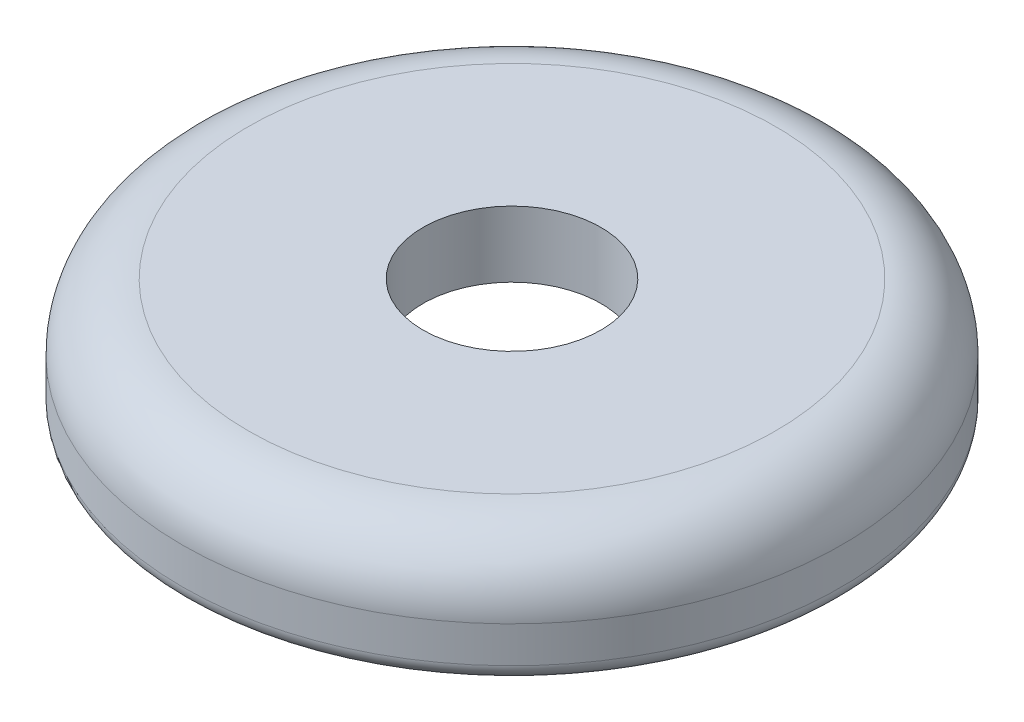
ISO-10303-21;
HEADER;
FILE_DESCRIPTION(('STEP AP214'),'2;1');
FILE_NAME('part.step','',(''),(''),'','','');
FILE_SCHEMA(('AUTOMOTIVE_DESIGN { 1 0 10303 214 1 1 1 1 }'));
ENDSEC;
DATA;
#1=APPLICATION_CONTEXT('core data for automotive mechanical design processes');
#2=APPLICATION_PROTOCOL_DEFINITION('international standard','automotive_design',2000,#1);
#3=PRODUCT_CONTEXT('',#1,'mechanical');
#4=PRODUCT('Part','Part','',(#3));
#5=PRODUCT_RELATED_PRODUCT_CATEGORY('part','',(#4));
#6=PRODUCT_DEFINITION_FORMATION('','',#4);
#7=PRODUCT_DEFINITION_CONTEXT('part definition',#1,'design');
#8=PRODUCT_DEFINITION('design','',#6,#7);
#9=PRODUCT_DEFINITION_SHAPE('','',#8);
#10=(LENGTH_UNIT() NAMED_UNIT(*) SI_UNIT(.MILLI.,.METRE.));
#11=(NAMED_UNIT(*) PLANE_ANGLE_UNIT() SI_UNIT($,.RADIAN.));
#12=(NAMED_UNIT(*) SI_UNIT($,.STERADIAN.) SOLID_ANGLE_UNIT());
#13=UNCERTAINTY_MEASURE_WITH_UNIT(LENGTH_MEASURE(1.E-05),#10,'distance_accuracy_value','');
#14=(GEOMETRIC_REPRESENTATION_CONTEXT(3) GLOBAL_UNCERTAINTY_ASSIGNED_CONTEXT((#13)) GLOBAL_UNIT_ASSIGNED_CONTEXT((#10,
#11,#12)) REPRESENTATION_CONTEXT('',''));
#15=CARTESIAN_POINT('',(0.,0.,0.));
#16=DIRECTION('',(0.,0.,1.));
#17=DIRECTION('',(1.,0.,0.));
#18=AXIS2_PLACEMENT_3D('',#15,#16,#17);
#19=CARTESIAN_POINT('',(0.,0.,0.));
#20=DIRECTION('',(0.,1.,0.));
#21=DIRECTION('',(0.,0.,1.));
#22=AXIS2_PLACEMENT_3D('',#19,#20,#21);
#23=PLANE('',#22);
#24=DIRECTION('',(0.5,0.,0.866025403784438));
#25=VECTOR('',#24,1.);
#26=CARTESIAN_POINT('',(-4.28942382494432,0.,6.7945));
#27=LINE('',#26,#25);
#28=CARTESIAN_POINT('',(-8.21223022895324,0.,0.));
#29=VERTEX_POINT('',#28);
#30=CARTESIAN_POINT('',(-4.10611511447661,0.,7.112));
#31=VERTEX_POINT('',#30);
#32=EDGE_CURVE('E172',#29,#31,#27,.T.);
#33=ORIENTED_EDGE('',*,*,#32,.T.);
#34=DIRECTION('',(1.,0.,0.));
#35=VECTOR('',#34,1.);
#36=CARTESIAN_POINT('',(3.73949769354121,0.,7.112));
#37=LINE('',#36,#35);
#38=CARTESIAN_POINT('',(4.10611511447662,0.,7.112));
#39=VERTEX_POINT('',#38);
#40=EDGE_CURVE('E175',#31,#39,#37,.T.);
#41=ORIENTED_EDGE('',*,*,#40,.T.);
#42=DIRECTION('',(0.5,0.,-0.866025403784439));
#43=VECTOR('',#42,1.);
#44=CARTESIAN_POINT('',(8.02892151848553,0.,0.317499999999998));
#45=LINE('',#44,#43);
#46=CARTESIAN_POINT('',(8.21223022895324,0.,0.));
#47=VERTEX_POINT('',#46);
#48=EDGE_CURVE('E160',#39,#47,#45,.T.);
#49=ORIENTED_EDGE('',*,*,#48,.T.);
#50=DIRECTION('',(-0.5,0.,-0.866025403784438));
#51=VECTOR('',#50,1.);
#52=CARTESIAN_POINT('',(4.28942382494432,0.,-6.7945));
#53=LINE('',#52,#51);
#54=CARTESIAN_POINT('',(4.10611511447662,0.,-7.112));
#55=VERTEX_POINT('',#54);
#56=EDGE_CURVE('E163',#47,#55,#53,.T.);
#57=ORIENTED_EDGE('',*,*,#56,.T.);
#58=DIRECTION('',(-1.,0.,0.));
#59=VECTOR('',#58,1.);
#60=CARTESIAN_POINT('',(-3.73949769354121,0.,-7.112));
#61=LINE('',#60,#59);
#62=CARTESIAN_POINT('',(-4.10611511447662,0.,-7.112));
#63=VERTEX_POINT('',#62);
#64=EDGE_CURVE('E166',#55,#63,#61,.T.);
#65=ORIENTED_EDGE('',*,*,#64,.T.);
#66=DIRECTION('',(-0.5,0.,0.866025403784439));
#67=VECTOR('',#66,1.);
#68=CARTESIAN_POINT('',(-8.02892151848553,0.,-0.317500000000003));
#69=LINE('',#68,#67);
#70=EDGE_CURVE('E169',#63,#29,#69,.T.);
#71=ORIENTED_EDGE('',*,*,#70,.T.);
#72=EDGE_LOOP('',(#33,#41,#49,#57,#65,#71));
#73=FACE_BOUND('',#72,.T.);
#74=CARTESIAN_POINT('',(0.,0.,0.));
#75=DIRECTION('',(0.,1.,0.));
#76=DIRECTION('',(0.,0.,1.));
#77=AXIS2_PLACEMENT_3D('',#74,#75,#76);
#78=CIRCLE('',#77,12.065);
#79=CARTESIAN_POINT('',(0.,0.,12.065));
#80=VERTEX_POINT('',#79);
#81=EDGE_CURVE('E156',#80,#80,#78,.F.);
#82=ORIENTED_EDGE('',*,*,#81,.T.);
#83=EDGE_LOOP('',(#82));
#84=FACE_BOUND('',#83,.T.);
#85=ADVANCED_FACE('F43',(#73,#84),#23,.F.);
#86=CARTESIAN_POINT('',(0.,2.032,0.));
#87=DIRECTION('',(0.,-1.,0.));
#88=DIRECTION('',(0.,0.,-1.));
#89=AXIS2_PLACEMENT_3D('',#86,#87,#88);
#90=CYLINDRICAL_SURFACE('',#89,12.7);
#91=CARTESIAN_POINT('',(0.,0.635,0.));
#92=DIRECTION('',(0.,1.,0.));
#93=DIRECTION('',(0.,0.,1.));
#94=AXIS2_PLACEMENT_3D('',#91,#92,#93);
#95=CIRCLE('',#94,12.7);
#96=CARTESIAN_POINT('',(0.,0.635,12.7));
#97=VERTEX_POINT('',#96);
#98=EDGE_CURVE('E11',#97,#97,#95,.T.);
#99=ORIENTED_EDGE('',*,*,#98,.T.);
#100=EDGE_LOOP('',(#99));
#101=FACE_BOUND('',#100,.T.);
#102=CARTESIAN_POINT('',(0.,2.032,0.));
#103=DIRECTION('',(0.,1.,0.));
#104=DIRECTION('',(0.,0.,1.));
#105=AXIS2_PLACEMENT_3D('',#102,#103,#104);
#106=CIRCLE('',#105,12.7);
#107=CARTESIAN_POINT('',(0.,2.032,12.7));
#108=VERTEX_POINT('',#107);
#109=EDGE_CURVE('E152',#108,#108,#106,.F.);
#110=ORIENTED_EDGE('',*,*,#109,.T.);
#111=EDGE_LOOP('',(#110));
#112=FACE_BOUND('',#111,.T.);
#113=ADVANCED_FACE('F293',(#101,#112),#90,.T.);
#114=CARTESIAN_POINT('',(3.73949769354121,2.032,6.477));
#115=DIRECTION('',(-0.866025403784439,0.,-0.5));
#116=DIRECTION('',(-0.5,0.,0.866025403784439));
#117=AXIS2_PLACEMENT_3D('',#114,#115,#116);
#118=PLANE('',#117);
#119=DIRECTION('',(0.,-1.,0.));
#120=VECTOR('',#119,1.);
#121=CARTESIAN_POINT('',(7.47899538708242,2.032,0.));
#122=LINE('',#121,#120);
#123=CARTESIAN_POINT('',(7.47899538708242,2.032,0.));
#124=VERTEX_POINT('',#123);
#125=CARTESIAN_POINT('',(7.47899538708242,0.635,0.));
#126=VERTEX_POINT('',#125);
#127=EDGE_CURVE('E133',#124,#126,#122,.T.);
#128=ORIENTED_EDGE('',*,*,#127,.T.);
#129=DIRECTION('',(0.5,0.,-0.866025403784439));
#130=VECTOR('',#129,1.);
#131=CARTESIAN_POINT('',(3.73949769354121,0.635,6.477));
#132=LINE('',#131,#130);
#133=CARTESIAN_POINT('',(3.73949769354121,0.635,6.477));
#134=VERTEX_POINT('',#133);
#135=EDGE_CURVE('E53',#126,#134,#132,.F.);
#136=ORIENTED_EDGE('',*,*,#135,.T.);
#137=DIRECTION('',(0.,-1.,0.));
#138=VECTOR('',#137,1.);
#139=CARTESIAN_POINT('',(3.73949769354121,2.032,6.477));
#140=LINE('',#139,#138);
#141=CARTESIAN_POINT('',(3.73949769354121,2.032,6.477));
#142=VERTEX_POINT('',#141);
#143=EDGE_CURVE('E241',#142,#134,#140,.T.);
#144=ORIENTED_EDGE('',*,*,#143,.F.);
#145=DIRECTION('',(0.5,0.,-0.866025403784438));
#146=VECTOR('',#145,1.);
#147=CARTESIAN_POINT('',(3.73949769354121,2.032,6.477));
#148=LINE('',#147,#146);
#149=EDGE_CURVE('E135',#142,#124,#148,.T.);
#150=ORIENTED_EDGE('',*,*,#149,.T.);
#151=EDGE_LOOP('',(#128,#136,#144,#150));
#152=FACE_BOUND('',#151,.T.);
#153=ADVANCED_FACE('F276',(#152),#118,.T.);
#154=CARTESIAN_POINT('',(7.47899538708242,2.032,0.));
#155=DIRECTION('',(-0.866025403784438,0.,0.5));
#156=DIRECTION('',(0.5,0.,0.866025403784438));
#157=AXIS2_PLACEMENT_3D('',#154,#155,#156);
#158=PLANE('',#157);
#159=DIRECTION('',(0.,-1.,0.));
#160=VECTOR('',#159,1.);
#161=CARTESIAN_POINT('',(3.73949769354121,2.032,-6.477));
#162=LINE('',#161,#160);
#163=CARTESIAN_POINT('',(3.73949769354121,2.032,-6.477));
#164=VERTEX_POINT('',#163);
#165=CARTESIAN_POINT('',(3.73949769354121,0.635,-6.477));
#166=VERTEX_POINT('',#165);
#167=EDGE_CURVE('E131',#164,#166,#162,.T.);
#168=ORIENTED_EDGE('',*,*,#167,.T.);
#169=DIRECTION('',(-0.5,0.,-0.866025403784438));
#170=VECTOR('',#169,1.);
#171=CARTESIAN_POINT('',(7.47899538708242,0.635,0.));
#172=LINE('',#171,#170);
#173=EDGE_CURVE('E61',#166,#126,#172,.F.);
#174=ORIENTED_EDGE('',*,*,#173,.T.);
#175=ORIENTED_EDGE('',*,*,#127,.F.);
#176=DIRECTION('',(-0.5,0.,-0.866025403784438));
#177=VECTOR('',#176,1.);
#178=CARTESIAN_POINT('',(7.47899538708242,2.032,0.));
#179=LINE('',#178,#177);
#180=EDGE_CURVE('E123',#124,#164,#179,.T.);
#181=ORIENTED_EDGE('',*,*,#180,.T.);
#182=EDGE_LOOP('',(#168,#174,#175,#181));
#183=FACE_BOUND('',#182,.T.);
#184=ADVANCED_FACE('F130',(#183),#158,.T.);
#185=CARTESIAN_POINT('',(3.73949769354121,2.032,-6.477));
#186=DIRECTION('',(0.,0.,1.));
#187=DIRECTION('',(1.,0.,0.));
#188=AXIS2_PLACEMENT_3D('',#185,#186,#187);
#189=PLANE('',#188);
#190=DIRECTION('',(0.,-1.,0.));
#191=VECTOR('',#190,1.);
#192=CARTESIAN_POINT('',(-3.73949769354121,2.032,-6.477));
#193=LINE('',#192,#191);
#194=CARTESIAN_POINT('',(-3.73949769354121,2.032,-6.477));
#195=VERTEX_POINT('',#194);
#196=CARTESIAN_POINT('',(-3.73949769354121,0.635,-6.477));
#197=VERTEX_POINT('',#196);
#198=EDGE_CURVE('E139',#195,#197,#193,.T.);
#199=ORIENTED_EDGE('',*,*,#198,.T.);
#200=DIRECTION('',(-1.,0.,0.));
#201=VECTOR('',#200,1.);
#202=CARTESIAN_POINT('',(3.73949769354121,0.635,-6.477));
#203=LINE('',#202,#201);
#204=EDGE_CURVE('E69',#197,#166,#203,.F.);
#205=ORIENTED_EDGE('',*,*,#204,.T.);
#206=ORIENTED_EDGE('',*,*,#167,.F.);
#207=DIRECTION('',(-1.,0.,0.));
#208=VECTOR('',#207,1.);
#209=CARTESIAN_POINT('',(3.73949769354121,2.032,-6.477));
#210=LINE('',#209,#208);
#211=EDGE_CURVE('E119',#164,#195,#210,.T.);
#212=ORIENTED_EDGE('',*,*,#211,.T.);
#213=EDGE_LOOP('',(#199,#205,#206,#212));
#214=FACE_BOUND('',#213,.T.);
#215=ADVANCED_FACE('F137',(#214),#189,.T.);
#216=CARTESIAN_POINT('',(-3.73949769354121,2.032,-6.477));
#217=DIRECTION('',(0.866025403784438,0.,0.5));
#218=DIRECTION('',(0.5,0.,-0.866025403784439));
#219=AXIS2_PLACEMENT_3D('',#216,#217,#218);
#220=PLANE('',#219);
#221=DIRECTION('',(0.,-1.,0.));
#222=VECTOR('',#221,1.);
#223=CARTESIAN_POINT('',(-7.47899538708241,2.032,0.));
#224=LINE('',#223,#222);
#225=CARTESIAN_POINT('',(-7.47899538708241,2.032,0.));
#226=VERTEX_POINT('',#225);
#227=CARTESIAN_POINT('',(-7.47899538708241,0.635,0.));
#228=VERTEX_POINT('',#227);
#229=EDGE_CURVE('E145',#226,#228,#224,.T.);
#230=ORIENTED_EDGE('',*,*,#229,.T.);
#231=DIRECTION('',(-0.5,0.,0.866025403784439));
#232=VECTOR('',#231,1.);
#233=CARTESIAN_POINT('',(-3.7394976935412,0.635,-6.477));
#234=LINE('',#233,#232);
#235=EDGE_CURVE('E186',#228,#197,#234,.F.);
#236=ORIENTED_EDGE('',*,*,#235,.T.);
#237=ORIENTED_EDGE('',*,*,#198,.F.);
#238=DIRECTION('',(-0.5,0.,0.866025403784438));
#239=VECTOR('',#238,1.);
#240=CARTESIAN_POINT('',(-3.73949769354121,2.032,-6.477));
#241=LINE('',#240,#239);
#242=EDGE_CURVE('E126',#195,#226,#241,.T.);
#243=ORIENTED_EDGE('',*,*,#242,.T.);
#244=EDGE_LOOP('',(#230,#236,#237,#243));
#245=FACE_BOUND('',#244,.T.);
#246=ADVANCED_FACE('F252',(#245),#220,.T.);
#247=CARTESIAN_POINT('',(-7.47899538708241,2.032,0.));
#248=DIRECTION('',(0.866025403784438,0.,-0.5));
#249=DIRECTION('',(-0.5,0.,-0.866025403784438));
#250=AXIS2_PLACEMENT_3D('',#247,#248,#249);
#251=PLANE('',#250);
#252=DIRECTION('',(0.,-1.,0.));
#253=VECTOR('',#252,1.);
#254=CARTESIAN_POINT('',(-3.7394976935412,2.032,6.477));
#255=LINE('',#254,#253);
#256=CARTESIAN_POINT('',(-3.7394976935412,2.032,6.477));
#257=VERTEX_POINT('',#256);
#258=CARTESIAN_POINT('',(-3.7394976935412,0.635,6.477));
#259=VERTEX_POINT('',#258);
#260=EDGE_CURVE('E245',#257,#259,#255,.T.);
#261=ORIENTED_EDGE('',*,*,#260,.T.);
#262=DIRECTION('',(0.5,0.,0.866025403784438));
#263=VECTOR('',#262,1.);
#264=CARTESIAN_POINT('',(-7.47899538708241,0.635,0.));
#265=LINE('',#264,#263);
#266=EDGE_CURVE('E183',#259,#228,#265,.F.);
#267=ORIENTED_EDGE('',*,*,#266,.T.);
#268=ORIENTED_EDGE('',*,*,#229,.F.);
#269=DIRECTION('',(0.5,0.,0.866025403784438));
#270=VECTOR('',#269,1.);
#271=CARTESIAN_POINT('',(-7.47899538708241,2.032,0.));
#272=LINE('',#271,#270);
#273=EDGE_CURVE('E233',#226,#257,#272,.T.);
#274=ORIENTED_EDGE('',*,*,#273,.T.);
#275=EDGE_LOOP('',(#261,#267,#268,#274));
#276=FACE_BOUND('',#275,.T.);
#277=ADVANCED_FACE('F327',(#276),#251,.T.);
#278=CARTESIAN_POINT('',(-3.7394976935412,2.032,6.477));
#279=DIRECTION('',(0.,0.,-1.));
#280=DIRECTION('',(-1.,0.,0.));
#281=AXIS2_PLACEMENT_3D('',#278,#279,#280);
#282=PLANE('',#281);
#283=ORIENTED_EDGE('',*,*,#143,.T.);
#284=DIRECTION('',(1.,0.,0.));
#285=VECTOR('',#284,1.);
#286=CARTESIAN_POINT('',(-3.7394976935412,0.635,6.477));
#287=LINE('',#286,#285);
#288=EDGE_CURVE('E179',#134,#259,#287,.F.);
#289=ORIENTED_EDGE('',*,*,#288,.T.);
#290=ORIENTED_EDGE('',*,*,#260,.F.);
#291=DIRECTION('',(1.,0.,0.));
#292=VECTOR('',#291,1.);
#293=CARTESIAN_POINT('',(-3.7394976935412,2.032,6.477));
#294=LINE('',#293,#292);
#295=EDGE_CURVE('E237',#257,#142,#294,.T.);
#296=ORIENTED_EDGE('',*,*,#295,.T.);
#297=EDGE_LOOP('',(#283,#289,#290,#296));
#298=FACE_BOUND('',#297,.T.);
#299=ADVANCED_FACE('F279',(#298),#282,.T.);
#300=CARTESIAN_POINT('',(0.,4.572,0.));
#301=DIRECTION('',(0.,1.,0.));
#302=DIRECTION('',(0.,0.,1.));
#303=AXIS2_PLACEMENT_3D('',#300,#301,#302);
#304=PLANE('',#303);
#305=CARTESIAN_POINT('',(0.,4.572,0.));
#306=DIRECTION('',(0.,1.,0.));
#307=DIRECTION('',(0.,0.,1.));
#308=AXIS2_PLACEMENT_3D('',#305,#306,#307);
#309=CIRCLE('',#308,10.16);
#310=CARTESIAN_POINT('',(0.,4.572,10.16));
#311=VERTEX_POINT('',#310);
#312=EDGE_CURVE('E143',#311,#311,#309,.T.);
#313=ORIENTED_EDGE('',*,*,#312,.T.);
#314=EDGE_LOOP('',(#313));
#315=FACE_BOUND('',#314,.T.);
#316=CARTESIAN_POINT('',(0.,4.572,0.));
#317=DIRECTION('',(0.,1.,0.));
#318=DIRECTION('',(0.,0.,1.));
#319=AXIS2_PLACEMENT_3D('',#316,#317,#318);
#320=CIRCLE('',#319,3.429);
#321=CARTESIAN_POINT('',(0.,4.572,3.429));
#322=VERTEX_POINT('',#321);
#323=EDGE_CURVE('E222',#322,#322,#320,.T.);
#324=ORIENTED_EDGE('',*,*,#323,.F.);
#325=EDGE_LOOP('',(#324));
#326=FACE_BOUND('',#325,.T.);
#327=ADVANCED_FACE('F316',(#315,#326),#304,.T.);
#328=CARTESIAN_POINT('',(0.,2.032,0.));
#329=DIRECTION('',(0.,1.,0.));
#330=DIRECTION('',(0.,0.,1.));
#331=AXIS2_PLACEMENT_3D('',#328,#329,#330);
#332=PLANE('',#331);
#333=ORIENTED_EDGE('',*,*,#180,.F.);
#334=ORIENTED_EDGE('',*,*,#149,.F.);
#335=ORIENTED_EDGE('',*,*,#295,.F.);
#336=ORIENTED_EDGE('',*,*,#273,.F.);
#337=ORIENTED_EDGE('',*,*,#242,.F.);
#338=ORIENTED_EDGE('',*,*,#211,.F.);
#339=EDGE_LOOP('',(#333,#334,#335,#336,#337,#338));
#340=FACE_BOUND('',#339,.T.);
#341=CARTESIAN_POINT('',(0.,2.032,0.));
#342=DIRECTION('',(0.,1.,0.));
#343=DIRECTION('',(0.,0.,1.));
#344=AXIS2_PLACEMENT_3D('',#341,#342,#343);
#345=CIRCLE('',#344,3.429);
#346=CARTESIAN_POINT('',(0.,2.032,3.429));
#347=VERTEX_POINT('',#346);
#348=EDGE_CURVE('E215',#347,#347,#345,.T.);
#349=ORIENTED_EDGE('',*,*,#348,.T.);
#350=EDGE_LOOP('',(#349));
#351=FACE_BOUND('',#350,.T.);
#352=ADVANCED_FACE('F121',(#340,#351),#332,.F.);
#353=CARTESIAN_POINT('',(0.,4.572,0.));
#354=DIRECTION('',(0.,-1.,0.));
#355=DIRECTION('',(0.,0.,-1.));
#356=AXIS2_PLACEMENT_3D('',#353,#354,#355);
#357=CYLINDRICAL_SURFACE('',#356,3.429);
#358=ORIENTED_EDGE('',*,*,#323,.T.);
#359=EDGE_LOOP('',(#358));
#360=FACE_BOUND('',#359,.T.);
#361=ORIENTED_EDGE('',*,*,#348,.F.);
#362=EDGE_LOOP('',(#361));
#363=FACE_BOUND('',#362,.T.);
#364=ADVANCED_FACE('F304',(#360,#363),#357,.F.);
#365=CARTESIAN_POINT('',(0.,2.032,0.));
#366=DIRECTION('',(0.,1.,0.));
#367=DIRECTION('',(0.,0.,1.));
#368=AXIS2_PLACEMENT_3D('',#365,#366,#367);
#369=TOROIDAL_SURFACE('',#368,10.16,2.54);
#370=ORIENTED_EDGE('',*,*,#109,.F.);
#371=EDGE_LOOP('',(#370));
#372=FACE_BOUND('',#371,.T.);
#373=ORIENTED_EDGE('',*,*,#312,.F.);
#374=EDGE_LOOP('',(#373));
#375=FACE_BOUND('',#374,.T.);
#376=ADVANCED_FACE('F302',(#372,#375),#369,.T.);
#377=CARTESIAN_POINT('',(0.,0.635,-7.112));
#378=DIRECTION('',(1.,0.,0.));
#379=DIRECTION('',(0.,0.,-1.));
#380=AXIS2_PLACEMENT_3D('',#377,#378,#379);
#381=CYLINDRICAL_SURFACE('',#380,0.635);
#382=CARTESIAN_POINT('',(4.10611511447662,0.635,-7.112));
#383=DIRECTION('',(0.866025403784439,0.,0.5));
#384=DIRECTION('',(0.5,0.,-0.866025403784439));
#385=AXIS2_PLACEMENT_3D('',#382,#383,#384);
#386=ELLIPSE('',#385,0.733234841870825,0.635);
#387=EDGE_CURVE('E208',#166,#55,#386,.T.);
#388=ORIENTED_EDGE('',*,*,#387,.F.);
#389=ORIENTED_EDGE('',*,*,#204,.F.);
#390=CARTESIAN_POINT('',(-4.10611511447662,0.635,-7.112));
#391=DIRECTION('',(0.866025403784439,0.,-0.5));
#392=DIRECTION('',(-0.5,0.,-0.866025403784439));
#393=AXIS2_PLACEMENT_3D('',#390,#391,#392);
#394=ELLIPSE('',#393,0.733234841870825,0.635);
#395=EDGE_CURVE('E47',#63,#197,#394,.F.);
#396=ORIENTED_EDGE('',*,*,#395,.F.);
#397=ORIENTED_EDGE('',*,*,#64,.F.);
#398=EDGE_LOOP('',(#388,#389,#396,#397));
#399=FACE_BOUND('',#398,.T.);
#400=ADVANCED_FACE('F266',(#399),#381,.T.);
#401=CARTESIAN_POINT('',(-6.15917267171493,0.635,-3.556));
#402=DIRECTION('',(0.5,0.,-0.866025403784439));
#403=DIRECTION('',(-0.866025403784438,0.,-0.5));
#404=AXIS2_PLACEMENT_3D('',#401,#402,#403);
#405=CYLINDRICAL_SURFACE('',#404,0.635);
#406=ORIENTED_EDGE('',*,*,#395,.T.);
#407=ORIENTED_EDGE('',*,*,#235,.F.);
#408=CARTESIAN_POINT('',(-8.21223022895324,0.635,0.));
#409=DIRECTION('',(0.,0.,-1.));
#410=DIRECTION('',(-1.,0.,0.));
#411=AXIS2_PLACEMENT_3D('',#408,#409,#410);
#412=ELLIPSE('',#411,0.733234841870825,0.635);
#413=EDGE_CURVE('E205',#29,#228,#412,.F.);
#414=ORIENTED_EDGE('',*,*,#413,.F.);
#415=ORIENTED_EDGE('',*,*,#70,.F.);
#416=EDGE_LOOP('',(#406,#407,#414,#415));
#417=FACE_BOUND('',#416,.T.);
#418=ADVANCED_FACE('F255',(#417),#405,.T.);
#419=CARTESIAN_POINT('',(6.15917267171493,0.635,-3.556));
#420=DIRECTION('',(0.5,0.,0.866025403784438));
#421=DIRECTION('',(0.866025403784438,0.,-0.5));
#422=AXIS2_PLACEMENT_3D('',#419,#420,#421);
#423=CYLINDRICAL_SURFACE('',#422,0.635);
#424=ORIENTED_EDGE('',*,*,#387,.T.);
#425=ORIENTED_EDGE('',*,*,#56,.F.);
#426=CARTESIAN_POINT('',(8.21223022895324,0.635,0.));
#427=DIRECTION('',(0.,0.,1.));
#428=DIRECTION('',(1.,0.,0.));
#429=AXIS2_PLACEMENT_3D('',#426,#427,#428);
#430=ELLIPSE('',#429,0.733234841870825,0.635);
#431=EDGE_CURVE('E201',#126,#47,#430,.T.);
#432=ORIENTED_EDGE('',*,*,#431,.F.);
#433=ORIENTED_EDGE('',*,*,#173,.F.);
#434=EDGE_LOOP('',(#424,#425,#432,#433));
#435=FACE_BOUND('',#434,.T.);
#436=ADVANCED_FACE('F268',(#435),#423,.T.);
#437=CARTESIAN_POINT('',(-6.15917267171492,0.635,3.556));
#438=DIRECTION('',(-0.5,0.,-0.866025403784438));
#439=DIRECTION('',(-0.866025403784438,0.,0.5));
#440=AXIS2_PLACEMENT_3D('',#437,#438,#439);
#441=CYLINDRICAL_SURFACE('',#440,0.635);
#442=ORIENTED_EDGE('',*,*,#413,.T.);
#443=ORIENTED_EDGE('',*,*,#266,.F.);
#444=CARTESIAN_POINT('',(-4.10611511447661,0.635,7.112));
#445=DIRECTION('',(-0.866025403784439,0.,-0.5));
#446=DIRECTION('',(-0.5,0.,0.866025403784439));
#447=AXIS2_PLACEMENT_3D('',#444,#445,#446);
#448=ELLIPSE('',#447,0.733234841870825,0.635);
#449=EDGE_CURVE('E198',#31,#259,#448,.F.);
#450=ORIENTED_EDGE('',*,*,#449,.F.);
#451=ORIENTED_EDGE('',*,*,#32,.F.);
#452=EDGE_LOOP('',(#442,#443,#450,#451));
#453=FACE_BOUND('',#452,.T.);
#454=ADVANCED_FACE('F259',(#453),#441,.T.);
#455=CARTESIAN_POINT('',(6.15917267171493,0.635,3.556));
#456=DIRECTION('',(-0.5,0.,0.866025403784439));
#457=DIRECTION('',(0.866025403784439,0.,0.5));
#458=AXIS2_PLACEMENT_3D('',#455,#456,#457);
#459=CYLINDRICAL_SURFACE('',#458,0.635);
#460=ORIENTED_EDGE('',*,*,#431,.T.);
#461=ORIENTED_EDGE('',*,*,#48,.F.);
#462=CARTESIAN_POINT('',(4.10611511447662,0.635,7.112));
#463=DIRECTION('',(-0.866025403784439,0.,0.5));
#464=DIRECTION('',(-0.5,0.,-0.866025403784439));
#465=AXIS2_PLACEMENT_3D('',#462,#463,#464);
#466=ELLIPSE('',#465,0.733234841870825,0.635);
#467=EDGE_CURVE('E195',#134,#39,#466,.T.);
#468=ORIENTED_EDGE('',*,*,#467,.F.);
#469=ORIENTED_EDGE('',*,*,#135,.F.);
#470=EDGE_LOOP('',(#460,#461,#468,#469));
#471=FACE_BOUND('',#470,.T.);
#472=ADVANCED_FACE('F273',(#471),#459,.T.);
#473=CARTESIAN_POINT('',(0.,0.635,7.112));
#474=DIRECTION('',(-1.,0.,0.));
#475=DIRECTION('',(0.,0.,1.));
#476=AXIS2_PLACEMENT_3D('',#473,#474,#475);
#477=CYLINDRICAL_SURFACE('',#476,0.635);
#478=ORIENTED_EDGE('',*,*,#449,.T.);
#479=ORIENTED_EDGE('',*,*,#288,.F.);
#480=ORIENTED_EDGE('',*,*,#467,.T.);
#481=ORIENTED_EDGE('',*,*,#40,.F.);
#482=EDGE_LOOP('',(#478,#479,#480,#481));
#483=FACE_BOUND('',#482,.T.);
#484=ADVANCED_FACE('F282',(#483),#477,.T.);
#485=CARTESIAN_POINT('',(0.,0.635,0.));
#486=DIRECTION('',(0.,1.,0.));
#487=DIRECTION('',(0.,0.,1.));
#488=AXIS2_PLACEMENT_3D('',#485,#486,#487);
#489=TOROIDAL_SURFACE('',#488,12.065,0.635);
#490=ORIENTED_EDGE('',*,*,#81,.F.);
#491=EDGE_LOOP('',(#490));
#492=FACE_BOUND('',#491,.T.);
#493=ORIENTED_EDGE('',*,*,#98,.F.);
#494=EDGE_LOOP('',(#493));
#495=FACE_BOUND('',#494,.T.);
#496=ADVANCED_FACE('F45',(#492,#495),#489,.T.);
#497=CLOSED_SHELL('',(#85,#113,#153,#184,#215,#246,#277,#299,#327,#352,#364,#376,#400,#418,#436,
#454,#472,#484,#496));
#498=MANIFOLD_SOLID_BREP('B2',#497);
#499=ADVANCED_BREP_SHAPE_REPRESENTATION('',(#18,#498),#14);
#500=SHAPE_DEFINITION_REPRESENTATION(#9,#499);
ENDSEC;
END-ISO-10303-21;
